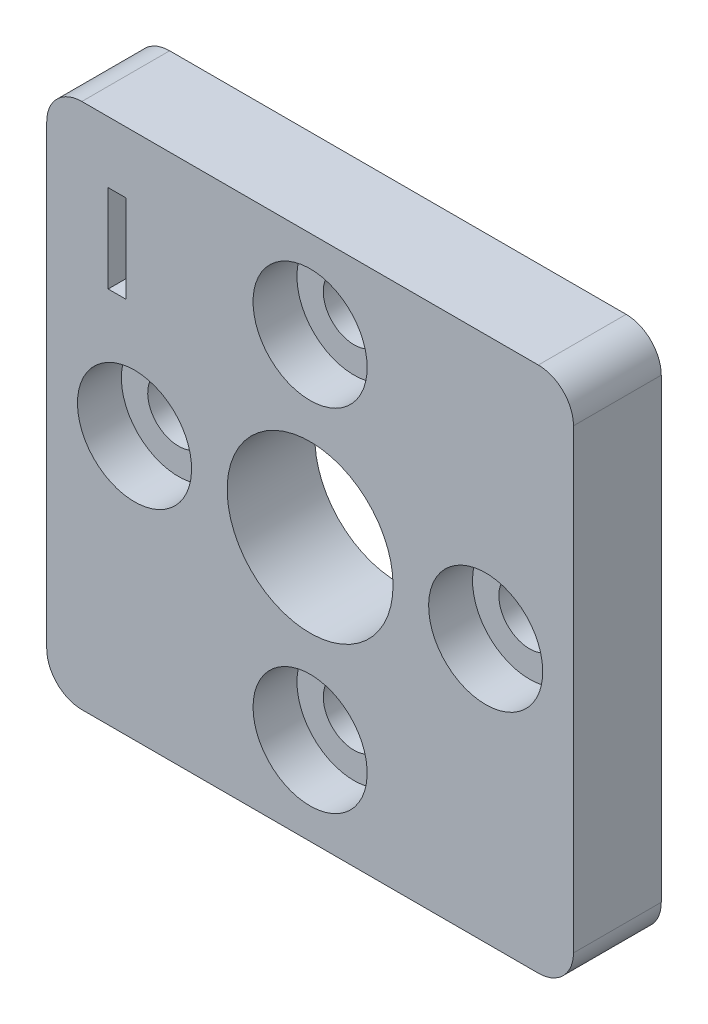
ISO-10303-21;
HEADER;
FILE_DESCRIPTION(('STEP AP214'),'2;1');
FILE_NAME('part.step','',(''),(''),'','','');
FILE_SCHEMA(('AUTOMOTIVE_DESIGN { 1 0 10303 214 1 1 1 1 }'));
ENDSEC;
DATA;
#1=APPLICATION_CONTEXT('core data for automotive mechanical design processes');
#2=APPLICATION_PROTOCOL_DEFINITION('international standard','automotive_design',2000,#1);
#3=PRODUCT_CONTEXT('',#1,'mechanical');
#4=PRODUCT('Part','Part','',(#3));
#5=PRODUCT_RELATED_PRODUCT_CATEGORY('part','',(#4));
#6=PRODUCT_DEFINITION_FORMATION('','',#4);
#7=PRODUCT_DEFINITION_CONTEXT('part definition',#1,'design');
#8=PRODUCT_DEFINITION('design','',#6,#7);
#9=PRODUCT_DEFINITION_SHAPE('','',#8);
#10=(LENGTH_UNIT() NAMED_UNIT(*) SI_UNIT(.MILLI.,.METRE.));
#11=(NAMED_UNIT(*) PLANE_ANGLE_UNIT() SI_UNIT($,.RADIAN.));
#12=(NAMED_UNIT(*) SI_UNIT($,.STERADIAN.) SOLID_ANGLE_UNIT());
#13=UNCERTAINTY_MEASURE_WITH_UNIT(LENGTH_MEASURE(1.E-05),#10,'distance_accuracy_value','');
#14=(GEOMETRIC_REPRESENTATION_CONTEXT(3) GLOBAL_UNCERTAINTY_ASSIGNED_CONTEXT((#13)) GLOBAL_UNIT_ASSIGNED_CONTEXT((#10,
#11,#12)) REPRESENTATION_CONTEXT('',''));
#15=CARTESIAN_POINT('',(0.,0.,0.));
#16=DIRECTION('',(0.,0.,1.));
#17=DIRECTION('',(1.,0.,0.));
#18=AXIS2_PLACEMENT_3D('',#15,#16,#17);
#19=CARTESIAN_POINT('',(10.,1.04286761324115E-13,5.));
#20=DIRECTION('',(0.,0.,-1.));
#21=DIRECTION('',(-1.,0.,0.));
#22=AXIS2_PLACEMENT_3D('',#19,#20,#21);
#23=CYLINDRICAL_SURFACE('',#22,1.75);
#24=CARTESIAN_POINT('',(10.,1.04286761324115E-13,0.));
#25=DIRECTION('',(0.,0.,1.));
#26=DIRECTION('',(0.,-1.,0.));
#27=AXIS2_PLACEMENT_3D('',#24,#25,#26);
#28=CIRCLE('',#27,1.75);
#29=CARTESIAN_POINT('',(10.,-1.7499999999999,0.));
#30=VERTEX_POINT('',#29);
#31=EDGE_CURVE('E199',#30,#30,#28,.T.);
#32=ORIENTED_EDGE('',*,*,#31,.F.);
#33=EDGE_LOOP('',(#32));
#34=FACE_BOUND('',#33,.T.);
#35=CARTESIAN_POINT('',(10.,1.04286761324115E-13,2.5));
#36=DIRECTION('',(0.,0.,1.));
#37=DIRECTION('',(1.,0.,0.));
#38=AXIS2_PLACEMENT_3D('',#35,#36,#37);
#39=CIRCLE('',#38,1.75);
#40=CARTESIAN_POINT('',(11.75,1.04286761324115E-13,2.5));
#41=VERTEX_POINT('',#40);
#42=EDGE_CURVE('E41',#41,#41,#39,.T.);
#43=ORIENTED_EDGE('',*,*,#42,.T.);
#44=EDGE_LOOP('',(#43));
#45=FACE_BOUND('',#44,.T.);
#46=ADVANCED_FACE('F37',(#34,#45),#23,.F.);
#47=CARTESIAN_POINT('',(0.,-10.,5.));
#48=DIRECTION('',(0.,0.,-1.));
#49=DIRECTION('',(-1.,0.,0.));
#50=AXIS2_PLACEMENT_3D('',#47,#48,#49);
#51=CYLINDRICAL_SURFACE('',#50,1.75);
#52=CARTESIAN_POINT('',(0.,-10.,0.));
#53=DIRECTION('',(0.,0.,1.));
#54=DIRECTION('',(-1.,0.,0.));
#55=AXIS2_PLACEMENT_3D('',#52,#53,#54);
#56=CIRCLE('',#55,1.75);
#57=CARTESIAN_POINT('',(-1.75,-10.,0.));
#58=VERTEX_POINT('',#57);
#59=EDGE_CURVE('E196',#58,#58,#56,.T.);
#60=ORIENTED_EDGE('',*,*,#59,.F.);
#61=EDGE_LOOP('',(#60));
#62=FACE_BOUND('',#61,.T.);
#63=CARTESIAN_POINT('',(0.,-10.,2.5));
#64=DIRECTION('',(0.,0.,1.));
#65=DIRECTION('',(1.,0.,0.));
#66=AXIS2_PLACEMENT_3D('',#63,#64,#65);
#67=CIRCLE('',#66,1.75);
#68=CARTESIAN_POINT('',(1.75,-10.,2.5));
#69=VERTEX_POINT('',#68);
#70=EDGE_CURVE('E268',#69,#69,#67,.T.);
#71=ORIENTED_EDGE('',*,*,#70,.T.);
#72=EDGE_LOOP('',(#71));
#73=FACE_BOUND('',#72,.T.);
#74=ADVANCED_FACE('F324',(#62,#73),#51,.F.);
#75=CARTESIAN_POINT('',(-10.,0.,5.));
#76=DIRECTION('',(0.,0.,-1.));
#77=DIRECTION('',(-1.,0.,0.));
#78=AXIS2_PLACEMENT_3D('',#75,#76,#77);
#79=CYLINDRICAL_SURFACE('',#78,1.75);
#80=CARTESIAN_POINT('',(-10.,0.,0.));
#81=DIRECTION('',(0.,0.,1.));
#82=DIRECTION('',(0.,1.,0.));
#83=AXIS2_PLACEMENT_3D('',#80,#81,#82);
#84=CIRCLE('',#83,1.75);
#85=CARTESIAN_POINT('',(-10.,1.74999999999996,0.));
#86=VERTEX_POINT('',#85);
#87=EDGE_CURVE('E192',#86,#86,#84,.T.);
#88=ORIENTED_EDGE('',*,*,#87,.F.);
#89=EDGE_LOOP('',(#88));
#90=FACE_BOUND('',#89,.T.);
#91=CARTESIAN_POINT('',(-10.,0.,2.5));
#92=DIRECTION('',(0.,0.,1.));
#93=DIRECTION('',(1.,0.,0.));
#94=AXIS2_PLACEMENT_3D('',#91,#92,#93);
#95=CIRCLE('',#94,1.75);
#96=CARTESIAN_POINT('',(-8.25,0.,2.5));
#97=VERTEX_POINT('',#96);
#98=EDGE_CURVE('E170',#97,#97,#95,.T.);
#99=ORIENTED_EDGE('',*,*,#98,.T.);
#100=EDGE_LOOP('',(#99));
#101=FACE_BOUND('',#100,.T.);
#102=ADVANCED_FACE('F330',(#90,#101),#79,.F.);
#103=CARTESIAN_POINT('',(0.,10.,5.));
#104=DIRECTION('',(0.,0.,-1.));
#105=DIRECTION('',(-1.,0.,0.));
#106=AXIS2_PLACEMENT_3D('',#103,#104,#105);
#107=CYLINDRICAL_SURFACE('',#106,1.75);
#108=CARTESIAN_POINT('',(0.,10.,0.));
#109=DIRECTION('',(0.,0.,1.));
#110=DIRECTION('',(1.,0.,0.));
#111=AXIS2_PLACEMENT_3D('',#108,#109,#110);
#112=CIRCLE('',#111,1.75);
#113=CARTESIAN_POINT('',(1.75,10.,0.));
#114=VERTEX_POINT('',#113);
#115=EDGE_CURVE('E195',#114,#114,#112,.T.);
#116=ORIENTED_EDGE('',*,*,#115,.F.);
#117=EDGE_LOOP('',(#116));
#118=FACE_BOUND('',#117,.T.);
#119=CARTESIAN_POINT('',(0.,10.,2.5));
#120=DIRECTION('',(0.,0.,1.));
#121=DIRECTION('',(1.,0.,0.));
#122=AXIS2_PLACEMENT_3D('',#119,#120,#121);
#123=CIRCLE('',#122,1.75);
#124=CARTESIAN_POINT('',(1.75,10.,2.5));
#125=VERTEX_POINT('',#124);
#126=EDGE_CURVE('E188',#125,#125,#123,.T.);
#127=ORIENTED_EDGE('',*,*,#126,.T.);
#128=EDGE_LOOP('',(#127));
#129=FACE_BOUND('',#128,.T.);
#130=ADVANCED_FACE('F293',(#118,#129),#107,.F.);
#131=CARTESIAN_POINT('',(0.,0.,5.));
#132=DIRECTION('',(0.,0.,1.));
#133=DIRECTION('',(1.,0.,0.));
#134=AXIS2_PLACEMENT_3D('',#131,#132,#133);
#135=PLANE('',#134);
#136=DIRECTION('',(0.,1.,0.));
#137=VECTOR('',#136,1.);
#138=CARTESIAN_POINT('',(-10.5,11.5,5.));
#139=LINE('',#138,#137);
#140=CARTESIAN_POINT('',(-10.5,6.5,5.));
#141=VERTEX_POINT('',#140);
#142=CARTESIAN_POINT('',(-10.5,11.5,5.));
#143=VERTEX_POINT('',#142);
#144=EDGE_CURVE('E54',#141,#143,#139,.T.);
#145=ORIENTED_EDGE('',*,*,#144,.F.);
#146=DIRECTION('',(1.,0.,0.));
#147=VECTOR('',#146,1.);
#148=CARTESIAN_POINT('',(-11.5,6.5,5.));
#149=LINE('',#148,#147);
#150=CARTESIAN_POINT('',(-11.5,6.5,5.));
#151=VERTEX_POINT('',#150);
#152=EDGE_CURVE('E148',#151,#141,#149,.T.);
#153=ORIENTED_EDGE('',*,*,#152,.F.);
#154=DIRECTION('',(0.,-1.,0.));
#155=VECTOR('',#154,1.);
#156=CARTESIAN_POINT('',(-11.5,11.5,5.));
#157=LINE('',#156,#155);
#158=CARTESIAN_POINT('',(-11.5,11.5,5.));
#159=VERTEX_POINT('',#158);
#160=EDGE_CURVE('E151',#159,#151,#157,.T.);
#161=ORIENTED_EDGE('',*,*,#160,.F.);
#162=DIRECTION('',(-1.,0.,0.));
#163=VECTOR('',#162,1.);
#164=CARTESIAN_POINT('',(-11.5,11.5,5.));
#165=LINE('',#164,#163);
#166=EDGE_CURVE('E157',#143,#159,#165,.T.);
#167=ORIENTED_EDGE('',*,*,#166,.F.);
#168=EDGE_LOOP('',(#145,#153,#161,#167));
#169=FACE_BOUND('',#168,.T.);
#170=CARTESIAN_POINT('',(-10.,0.,5.));
#171=DIRECTION('',(0.,0.,1.));
#172=DIRECTION('',(0.,1.,0.));
#173=AXIS2_PLACEMENT_3D('',#170,#171,#172);
#174=CIRCLE('',#173,3.25);
#175=CARTESIAN_POINT('',(-10.,3.24999999999997,5.));
#176=VERTEX_POINT('',#175);
#177=EDGE_CURVE('E171',#176,#176,#174,.T.);
#178=ORIENTED_EDGE('',*,*,#177,.F.);
#179=EDGE_LOOP('',(#178));
#180=FACE_BOUND('',#179,.T.);
#181=CARTESIAN_POINT('',(0.,-10.,5.));
#182=DIRECTION('',(0.,0.,1.));
#183=DIRECTION('',(-1.,0.,0.));
#184=AXIS2_PLACEMENT_3D('',#181,#182,#183);
#185=CIRCLE('',#184,3.25);
#186=CARTESIAN_POINT('',(-3.25,-10.,5.));
#187=VERTEX_POINT('',#186);
#188=EDGE_CURVE('E177',#187,#187,#185,.T.);
#189=ORIENTED_EDGE('',*,*,#188,.F.);
#190=EDGE_LOOP('',(#189));
#191=FACE_BOUND('',#190,.T.);
#192=CARTESIAN_POINT('',(10.,1.04286761324115E-13,5.));
#193=DIRECTION('',(0.,0.,1.));
#194=DIRECTION('',(0.,-1.,0.));
#195=AXIS2_PLACEMENT_3D('',#192,#193,#194);
#196=CIRCLE('',#195,3.25);
#197=CARTESIAN_POINT('',(10.,-3.2499999999999,5.));
#198=VERTEX_POINT('',#197);
#199=EDGE_CURVE('E163',#198,#198,#196,.T.);
#200=ORIENTED_EDGE('',*,*,#199,.F.);
#201=EDGE_LOOP('',(#200));
#202=FACE_BOUND('',#201,.T.);
#203=CARTESIAN_POINT('',(0.,10.,5.));
#204=DIRECTION('',(0.,0.,1.));
#205=DIRECTION('',(1.,0.,0.));
#206=AXIS2_PLACEMENT_3D('',#203,#204,#205);
#207=CIRCLE('',#206,3.25);
#208=CARTESIAN_POINT('',(3.25,10.,5.));
#209=VERTEX_POINT('',#208);
#210=EDGE_CURVE('E189',#209,#209,#207,.T.);
#211=ORIENTED_EDGE('',*,*,#210,.F.);
#212=EDGE_LOOP('',(#211));
#213=FACE_BOUND('',#212,.T.);
#214=DIRECTION('',(0.,-1.,0.));
#215=VECTOR('',#214,1.);
#216=CARTESIAN_POINT('',(-15.,-15.,5.));
#217=LINE('',#216,#215);
#218=CARTESIAN_POINT('',(-15.,13.,5.));
#219=VERTEX_POINT('',#218);
#220=CARTESIAN_POINT('',(-15.,-13.,5.));
#221=VERTEX_POINT('',#220);
#222=EDGE_CURVE('E211',#219,#221,#217,.T.);
#223=ORIENTED_EDGE('',*,*,#222,.T.);
#224=CARTESIAN_POINT('',(-13.,-13.,5.));
#225=DIRECTION('',(0.,0.,1.));
#226=DIRECTION('',(1.,0.,0.));
#227=AXIS2_PLACEMENT_3D('',#224,#225,#226);
#228=CIRCLE('',#227,2.);
#229=CARTESIAN_POINT('',(-13.,-15.,5.));
#230=VERTEX_POINT('',#229);
#231=EDGE_CURVE('E256',#221,#230,#228,.T.);
#232=ORIENTED_EDGE('',*,*,#231,.T.);
#233=DIRECTION('',(1.,0.,0.));
#234=VECTOR('',#233,1.);
#235=CARTESIAN_POINT('',(15.,-15.,5.));
#236=LINE('',#235,#234);
#237=CARTESIAN_POINT('',(13.,-15.,5.));
#238=VERTEX_POINT('',#237);
#239=EDGE_CURVE('E214',#230,#238,#236,.T.);
#240=ORIENTED_EDGE('',*,*,#239,.T.);
#241=CARTESIAN_POINT('',(13.,-13.,5.));
#242=DIRECTION('',(0.,0.,1.));
#243=DIRECTION('',(1.,0.,0.));
#244=AXIS2_PLACEMENT_3D('',#241,#242,#243);
#245=CIRCLE('',#244,2.);
#246=CARTESIAN_POINT('',(15.,-13.,5.));
#247=VERTEX_POINT('',#246);
#248=EDGE_CURVE('E254',#238,#247,#245,.T.);
#249=ORIENTED_EDGE('',*,*,#248,.T.);
#250=DIRECTION('',(0.,1.,0.));
#251=VECTOR('',#250,1.);
#252=CARTESIAN_POINT('',(15.,-15.,5.));
#253=LINE('',#252,#251);
#254=CARTESIAN_POINT('',(15.,13.,5.));
#255=VERTEX_POINT('',#254);
#256=EDGE_CURVE('E218',#247,#255,#253,.T.);
#257=ORIENTED_EDGE('',*,*,#256,.T.);
#258=CARTESIAN_POINT('',(13.,13.,5.));
#259=DIRECTION('',(0.,0.,1.));
#260=DIRECTION('',(1.,0.,0.));
#261=AXIS2_PLACEMENT_3D('',#258,#259,#260);
#262=CIRCLE('',#261,2.);
#263=CARTESIAN_POINT('',(13.,15.,5.));
#264=VERTEX_POINT('',#263);
#265=EDGE_CURVE('E250',#255,#264,#262,.T.);
#266=ORIENTED_EDGE('',*,*,#265,.T.);
#267=DIRECTION('',(-1.,0.,0.));
#268=VECTOR('',#267,1.);
#269=CARTESIAN_POINT('',(15.,15.,5.));
#270=LINE('',#269,#268);
#271=CARTESIAN_POINT('',(-13.,15.,5.));
#272=VERTEX_POINT('',#271);
#273=EDGE_CURVE('E221',#264,#272,#270,.T.);
#274=ORIENTED_EDGE('',*,*,#273,.T.);
#275=CARTESIAN_POINT('',(-13.,13.,5.));
#276=DIRECTION('',(0.,0.,1.));
#277=DIRECTION('',(1.,0.,0.));
#278=AXIS2_PLACEMENT_3D('',#275,#276,#277);
#279=CIRCLE('',#278,2.);
#280=EDGE_CURVE('E252',#272,#219,#279,.T.);
#281=ORIENTED_EDGE('',*,*,#280,.T.);
#282=EDGE_LOOP('',(#223,#232,#240,#249,#257,#266,#274,#281));
#283=FACE_BOUND('',#282,.T.);
#284=CARTESIAN_POINT('',(0.,0.,5.));
#285=DIRECTION('',(0.,0.,1.));
#286=DIRECTION('',(1.,0.,0.));
#287=AXIS2_PLACEMENT_3D('',#284,#285,#286);
#288=CIRCLE('',#287,4.725);
#289=CARTESIAN_POINT('',(4.725,0.,5.));
#290=VERTEX_POINT('',#289);
#291=EDGE_CURVE('E205',#290,#290,#288,.T.);
#292=ORIENTED_EDGE('',*,*,#291,.F.);
#293=EDGE_LOOP('',(#292));
#294=FACE_BOUND('',#293,.T.);
#295=ADVANCED_FACE('F289',(#169,#180,#191,#202,#213,#283,#294),#135,.T.);
#296=CARTESIAN_POINT('',(0.,0.,0.));
#297=DIRECTION('',(0.,0.,1.));
#298=DIRECTION('',(1.,0.,0.));
#299=AXIS2_PLACEMENT_3D('',#296,#297,#298);
#300=PLANE('',#299);
#301=ORIENTED_EDGE('',*,*,#87,.T.);
#302=EDGE_LOOP('',(#301));
#303=FACE_BOUND('',#302,.T.);
#304=ORIENTED_EDGE('',*,*,#59,.T.);
#305=EDGE_LOOP('',(#304));
#306=FACE_BOUND('',#305,.T.);
#307=ORIENTED_EDGE('',*,*,#31,.T.);
#308=EDGE_LOOP('',(#307));
#309=FACE_BOUND('',#308,.T.);
#310=ORIENTED_EDGE('',*,*,#115,.T.);
#311=EDGE_LOOP('',(#310));
#312=FACE_BOUND('',#311,.T.);
#313=DIRECTION('',(1.,0.,0.));
#314=VECTOR('',#313,1.);
#315=CARTESIAN_POINT('',(15.,-15.,0.));
#316=LINE('',#315,#314);
#317=CARTESIAN_POINT('',(-13.,-15.,0.));
#318=VERTEX_POINT('',#317);
#319=CARTESIAN_POINT('',(13.,-15.,0.));
#320=VERTEX_POINT('',#319);
#321=EDGE_CURVE('E226',#318,#320,#316,.T.);
#322=ORIENTED_EDGE('',*,*,#321,.F.);
#323=CARTESIAN_POINT('',(-13.,-13.,0.));
#324=DIRECTION('',(0.,0.,1.));
#325=DIRECTION('',(1.,0.,0.));
#326=AXIS2_PLACEMENT_3D('',#323,#324,#325);
#327=CIRCLE('',#326,2.);
#328=CARTESIAN_POINT('',(-15.,-13.,0.));
#329=VERTEX_POINT('',#328);
#330=EDGE_CURVE('E243',#318,#329,#327,.F.);
#331=ORIENTED_EDGE('',*,*,#330,.T.);
#332=DIRECTION('',(0.,-1.,0.));
#333=VECTOR('',#332,1.);
#334=CARTESIAN_POINT('',(-15.,-15.,0.));
#335=LINE('',#334,#333);
#336=CARTESIAN_POINT('',(-15.,13.,0.));
#337=VERTEX_POINT('',#336);
#338=EDGE_CURVE('E208',#337,#329,#335,.T.);
#339=ORIENTED_EDGE('',*,*,#338,.F.);
#340=CARTESIAN_POINT('',(-13.,13.,0.));
#341=DIRECTION('',(0.,0.,1.));
#342=DIRECTION('',(1.,0.,0.));
#343=AXIS2_PLACEMENT_3D('',#340,#341,#342);
#344=CIRCLE('',#343,2.);
#345=CARTESIAN_POINT('',(-13.,15.,0.));
#346=VERTEX_POINT('',#345);
#347=EDGE_CURVE('E239',#337,#346,#344,.F.);
#348=ORIENTED_EDGE('',*,*,#347,.T.);
#349=DIRECTION('',(-1.,0.,0.));
#350=VECTOR('',#349,1.);
#351=CARTESIAN_POINT('',(15.,15.,0.));
#352=LINE('',#351,#350);
#353=CARTESIAN_POINT('',(13.,15.,0.));
#354=VERTEX_POINT('',#353);
#355=EDGE_CURVE('E215',#354,#346,#352,.T.);
#356=ORIENTED_EDGE('',*,*,#355,.F.);
#357=CARTESIAN_POINT('',(13.,13.,0.));
#358=DIRECTION('',(0.,0.,1.));
#359=DIRECTION('',(1.,0.,0.));
#360=AXIS2_PLACEMENT_3D('',#357,#358,#359);
#361=CIRCLE('',#360,2.);
#362=CARTESIAN_POINT('',(15.,13.,0.));
#363=VERTEX_POINT('',#362);
#364=EDGE_CURVE('E237',#354,#363,#361,.F.);
#365=ORIENTED_EDGE('',*,*,#364,.T.);
#366=DIRECTION('',(0.,1.,0.));
#367=VECTOR('',#366,1.);
#368=CARTESIAN_POINT('',(15.,-15.,0.));
#369=LINE('',#368,#367);
#370=CARTESIAN_POINT('',(15.,-13.,0.));
#371=VERTEX_POINT('',#370);
#372=EDGE_CURVE('E229',#371,#363,#369,.T.);
#373=ORIENTED_EDGE('',*,*,#372,.F.);
#374=CARTESIAN_POINT('',(13.,-13.,0.));
#375=DIRECTION('',(0.,0.,1.));
#376=DIRECTION('',(1.,0.,0.));
#377=AXIS2_PLACEMENT_3D('',#374,#375,#376);
#378=CIRCLE('',#377,2.);
#379=EDGE_CURVE('E241',#371,#320,#378,.F.);
#380=ORIENTED_EDGE('',*,*,#379,.T.);
#381=EDGE_LOOP('',(#322,#331,#339,#348,#356,#365,#373,#380));
#382=FACE_BOUND('',#381,.T.);
#383=CARTESIAN_POINT('',(0.,0.,0.));
#384=DIRECTION('',(0.,0.,1.));
#385=DIRECTION('',(1.,0.,0.));
#386=AXIS2_PLACEMENT_3D('',#383,#384,#385);
#387=CIRCLE('',#386,4.725);
#388=CARTESIAN_POINT('',(4.725,0.,0.));
#389=VERTEX_POINT('',#388);
#390=EDGE_CURVE('E204',#389,#389,#387,.T.);
#391=ORIENTED_EDGE('',*,*,#390,.T.);
#392=EDGE_LOOP('',(#391));
#393=FACE_BOUND('',#392,.T.);
#394=ADVANCED_FACE('F292',(#303,#306,#309,#312,#382,#393),#300,.F.);
#395=CARTESIAN_POINT('',(-15.,-15.,5.));
#396=DIRECTION('',(1.,0.,0.));
#397=DIRECTION('',(0.,0.,-1.));
#398=AXIS2_PLACEMENT_3D('',#395,#396,#397);
#399=PLANE('',#398);
#400=ORIENTED_EDGE('',*,*,#338,.T.);
#401=DIRECTION('',(0.,0.,-1.));
#402=VECTOR('',#401,1.);
#403=CARTESIAN_POINT('',(-15.,-13.,5.));
#404=LINE('',#403,#402);
#405=EDGE_CURVE('E248',#329,#221,#404,.F.);
#406=ORIENTED_EDGE('',*,*,#405,.T.);
#407=ORIENTED_EDGE('',*,*,#222,.F.);
#408=DIRECTION('',(0.,0.,-1.));
#409=VECTOR('',#408,1.);
#410=CARTESIAN_POINT('',(-15.,13.,5.));
#411=LINE('',#410,#409);
#412=EDGE_CURVE('E245',#219,#337,#411,.T.);
#413=ORIENTED_EDGE('',*,*,#412,.T.);
#414=EDGE_LOOP('',(#400,#406,#407,#413));
#415=FACE_BOUND('',#414,.T.);
#416=ADVANCED_FACE('F312',(#415),#399,.F.);
#417=CARTESIAN_POINT('',(15.,-15.,5.));
#418=DIRECTION('',(0.,1.,0.));
#419=DIRECTION('',(-1.,0.,0.));
#420=AXIS2_PLACEMENT_3D('',#417,#418,#419);
#421=PLANE('',#420);
#422=ORIENTED_EDGE('',*,*,#239,.F.);
#423=DIRECTION('',(0.,0.,-1.));
#424=VECTOR('',#423,1.);
#425=CARTESIAN_POINT('',(-13.,-15.,5.));
#426=LINE('',#425,#424);
#427=EDGE_CURVE('E234',#230,#318,#426,.T.);
#428=ORIENTED_EDGE('',*,*,#427,.T.);
#429=ORIENTED_EDGE('',*,*,#321,.T.);
#430=DIRECTION('',(0.,0.,-1.));
#431=VECTOR('',#430,1.);
#432=CARTESIAN_POINT('',(13.,-15.,5.));
#433=LINE('',#432,#431);
#434=EDGE_CURVE('E223',#320,#238,#433,.F.);
#435=ORIENTED_EDGE('',*,*,#434,.T.);
#436=EDGE_LOOP('',(#422,#428,#429,#435));
#437=FACE_BOUND('',#436,.T.);
#438=ADVANCED_FACE('F318',(#437),#421,.F.);
#439=CARTESIAN_POINT('',(15.,-15.,5.));
#440=DIRECTION('',(-1.,0.,0.));
#441=DIRECTION('',(0.,0.,1.));
#442=AXIS2_PLACEMENT_3D('',#439,#440,#441);
#443=PLANE('',#442);
#444=ORIENTED_EDGE('',*,*,#256,.F.);
#445=DIRECTION('',(0.,0.,-1.));
#446=VECTOR('',#445,1.);
#447=CARTESIAN_POINT('',(15.,-13.,5.));
#448=LINE('',#447,#446);
#449=EDGE_CURVE('E260',#247,#371,#448,.T.);
#450=ORIENTED_EDGE('',*,*,#449,.T.);
#451=ORIENTED_EDGE('',*,*,#372,.T.);
#452=DIRECTION('',(0.,0.,-1.));
#453=VECTOR('',#452,1.);
#454=CARTESIAN_POINT('',(15.,13.,5.));
#455=LINE('',#454,#453);
#456=EDGE_CURVE('E258',#363,#255,#455,.F.);
#457=ORIENTED_EDGE('',*,*,#456,.T.);
#458=EDGE_LOOP('',(#444,#450,#451,#457));
#459=FACE_BOUND('',#458,.T.);
#460=ADVANCED_FACE('F518',(#459),#443,.F.);
#461=CARTESIAN_POINT('',(15.,15.,5.));
#462=DIRECTION('',(0.,-1.,0.));
#463=DIRECTION('',(1.,0.,0.));
#464=AXIS2_PLACEMENT_3D('',#461,#462,#463);
#465=PLANE('',#464);
#466=ORIENTED_EDGE('',*,*,#355,.T.);
#467=DIRECTION('',(0.,0.,-1.));
#468=VECTOR('',#467,1.);
#469=CARTESIAN_POINT('',(-13.,15.,5.));
#470=LINE('',#469,#468);
#471=EDGE_CURVE('E11',#346,#272,#470,.F.);
#472=ORIENTED_EDGE('',*,*,#471,.T.);
#473=ORIENTED_EDGE('',*,*,#273,.F.);
#474=DIRECTION('',(0.,0.,-1.));
#475=VECTOR('',#474,1.);
#476=CARTESIAN_POINT('',(13.,15.,5.));
#477=LINE('',#476,#475);
#478=EDGE_CURVE('E46',#264,#354,#477,.T.);
#479=ORIENTED_EDGE('',*,*,#478,.T.);
#480=EDGE_LOOP('',(#466,#472,#473,#479));
#481=FACE_BOUND('',#480,.T.);
#482=ADVANCED_FACE('F307',(#481),#465,.F.);
#483=CARTESIAN_POINT('',(0.,0.,5.));
#484=DIRECTION('',(0.,0.,-1.));
#485=DIRECTION('',(-1.,0.,0.));
#486=AXIS2_PLACEMENT_3D('',#483,#484,#485);
#487=CYLINDRICAL_SURFACE('',#486,4.725);
#488=ORIENTED_EDGE('',*,*,#291,.T.);
#489=EDGE_LOOP('',(#488));
#490=FACE_BOUND('',#489,.T.);
#491=ORIENTED_EDGE('',*,*,#390,.F.);
#492=EDGE_LOOP('',(#491));
#493=FACE_BOUND('',#492,.T.);
#494=ADVANCED_FACE('F303',(#490,#493),#487,.F.);
#495=CARTESIAN_POINT('',(-13.,-13.,5.));
#496=DIRECTION('',(0.,0.,-1.));
#497=DIRECTION('',(-1.,0.,0.));
#498=AXIS2_PLACEMENT_3D('',#495,#496,#497);
#499=CYLINDRICAL_SURFACE('',#498,2.);
#500=ORIENTED_EDGE('',*,*,#231,.F.);
#501=ORIENTED_EDGE('',*,*,#405,.F.);
#502=ORIENTED_EDGE('',*,*,#330,.F.);
#503=ORIENTED_EDGE('',*,*,#427,.F.);
#504=EDGE_LOOP('',(#500,#501,#502,#503));
#505=FACE_BOUND('',#504,.T.);
#506=ADVANCED_FACE('F306',(#505),#499,.T.);
#507=CARTESIAN_POINT('',(13.,-13.,5.));
#508=DIRECTION('',(0.,0.,-1.));
#509=DIRECTION('',(-1.,0.,0.));
#510=AXIS2_PLACEMENT_3D('',#507,#508,#509);
#511=CYLINDRICAL_SURFACE('',#510,2.);
#512=ORIENTED_EDGE('',*,*,#248,.F.);
#513=ORIENTED_EDGE('',*,*,#434,.F.);
#514=ORIENTED_EDGE('',*,*,#379,.F.);
#515=ORIENTED_EDGE('',*,*,#449,.F.);
#516=EDGE_LOOP('',(#512,#513,#514,#515));
#517=FACE_BOUND('',#516,.T.);
#518=ADVANCED_FACE('F485',(#517),#511,.T.);
#519=CARTESIAN_POINT('',(-13.,13.,5.));
#520=DIRECTION('',(0.,0.,-1.));
#521=DIRECTION('',(-1.,0.,0.));
#522=AXIS2_PLACEMENT_3D('',#519,#520,#521);
#523=CYLINDRICAL_SURFACE('',#522,2.);
#524=ORIENTED_EDGE('',*,*,#280,.F.);
#525=ORIENTED_EDGE('',*,*,#471,.F.);
#526=ORIENTED_EDGE('',*,*,#347,.F.);
#527=ORIENTED_EDGE('',*,*,#412,.F.);
#528=EDGE_LOOP('',(#524,#525,#526,#527));
#529=FACE_BOUND('',#528,.T.);
#530=ADVANCED_FACE('F360',(#529),#523,.T.);
#531=CARTESIAN_POINT('',(13.,13.,5.));
#532=DIRECTION('',(0.,0.,-1.));
#533=DIRECTION('',(-1.,0.,0.));
#534=AXIS2_PLACEMENT_3D('',#531,#532,#533);
#535=CYLINDRICAL_SURFACE('',#534,2.);
#536=ORIENTED_EDGE('',*,*,#265,.F.);
#537=ORIENTED_EDGE('',*,*,#456,.F.);
#538=ORIENTED_EDGE('',*,*,#364,.F.);
#539=ORIENTED_EDGE('',*,*,#478,.F.);
#540=EDGE_LOOP('',(#536,#537,#538,#539));
#541=FACE_BOUND('',#540,.T.);
#542=ADVANCED_FACE('F39',(#541),#535,.T.);
#543=CARTESIAN_POINT('',(0.,10.,2.5));
#544=DIRECTION('',(0.,0.,1.));
#545=DIRECTION('',(1.,0.,0.));
#546=AXIS2_PLACEMENT_3D('',#543,#544,#545);
#547=CYLINDRICAL_SURFACE('',#546,3.25);
#548=CARTESIAN_POINT('',(0.,10.,2.5));
#549=DIRECTION('',(0.,0.,1.));
#550=DIRECTION('',(1.,0.,0.));
#551=AXIS2_PLACEMENT_3D('',#548,#549,#550);
#552=CIRCLE('',#551,3.25);
#553=CARTESIAN_POINT('',(3.25,10.,2.5));
#554=VERTEX_POINT('',#553);
#555=EDGE_CURVE('E185',#554,#554,#552,.T.);
#556=ORIENTED_EDGE('',*,*,#555,.F.);
#557=EDGE_LOOP('',(#556));
#558=FACE_BOUND('',#557,.T.);
#559=ORIENTED_EDGE('',*,*,#210,.T.);
#560=EDGE_LOOP('',(#559));
#561=FACE_BOUND('',#560,.T.);
#562=ADVANCED_FACE('F350',(#558,#561),#547,.F.);
#563=CARTESIAN_POINT('',(0.,10.,2.5));
#564=DIRECTION('',(0.,0.,1.));
#565=DIRECTION('',(1.,0.,0.));
#566=AXIS2_PLACEMENT_3D('',#563,#564,#565);
#567=PLANE('',#566);
#568=ORIENTED_EDGE('',*,*,#126,.F.);
#569=EDGE_LOOP('',(#568));
#570=FACE_BOUND('',#569,.T.);
#571=ORIENTED_EDGE('',*,*,#555,.T.);
#572=EDGE_LOOP('',(#571));
#573=FACE_BOUND('',#572,.T.);
#574=ADVANCED_FACE('F346',(#570,#573),#567,.T.);
#575=CARTESIAN_POINT('',(-10.,0.,2.5));
#576=DIRECTION('',(0.,0.,1.));
#577=DIRECTION('',(1.,0.,0.));
#578=AXIS2_PLACEMENT_3D('',#575,#576,#577);
#579=CYLINDRICAL_SURFACE('',#578,3.25);
#580=CARTESIAN_POINT('',(-10.,0.,2.5));
#581=DIRECTION('',(0.,0.,1.));
#582=DIRECTION('',(0.,1.,0.));
#583=AXIS2_PLACEMENT_3D('',#580,#581,#582);
#584=CIRCLE('',#583,3.25);
#585=CARTESIAN_POINT('',(-10.,3.24999999999997,2.5));
#586=VERTEX_POINT('',#585);
#587=EDGE_CURVE('E167',#586,#586,#584,.T.);
#588=ORIENTED_EDGE('',*,*,#587,.F.);
#589=EDGE_LOOP('',(#588));
#590=FACE_BOUND('',#589,.T.);
#591=ORIENTED_EDGE('',*,*,#177,.T.);
#592=EDGE_LOOP('',(#591));
#593=FACE_BOUND('',#592,.T.);
#594=ADVANCED_FACE('F349',(#590,#593),#579,.F.);
#595=CARTESIAN_POINT('',(-10.,0.,2.5));
#596=DIRECTION('',(0.,0.,1.));
#597=DIRECTION('',(0.,1.,0.));
#598=AXIS2_PLACEMENT_3D('',#595,#596,#597);
#599=PLANE('',#598);
#600=ORIENTED_EDGE('',*,*,#98,.F.);
#601=EDGE_LOOP('',(#600));
#602=FACE_BOUND('',#601,.T.);
#603=ORIENTED_EDGE('',*,*,#587,.T.);
#604=EDGE_LOOP('',(#603));
#605=FACE_BOUND('',#604,.T.);
#606=ADVANCED_FACE('F366',(#602,#605),#599,.T.);
#607=CARTESIAN_POINT('',(0.,-10.,2.5));
#608=DIRECTION('',(0.,0.,1.));
#609=DIRECTION('',(1.,0.,0.));
#610=AXIS2_PLACEMENT_3D('',#607,#608,#609);
#611=CYLINDRICAL_SURFACE('',#610,3.25);
#612=CARTESIAN_POINT('',(0.,-10.,2.5));
#613=DIRECTION('',(0.,0.,1.));
#614=DIRECTION('',(-1.,0.,0.));
#615=AXIS2_PLACEMENT_3D('',#612,#613,#614);
#616=CIRCLE('',#615,3.25);
#617=CARTESIAN_POINT('',(-3.25,-10.,2.5));
#618=VERTEX_POINT('',#617);
#619=EDGE_CURVE('E174',#618,#618,#616,.T.);
#620=ORIENTED_EDGE('',*,*,#619,.F.);
#621=EDGE_LOOP('',(#620));
#622=FACE_BOUND('',#621,.T.);
#623=ORIENTED_EDGE('',*,*,#188,.T.);
#624=EDGE_LOOP('',(#623));
#625=FACE_BOUND('',#624,.T.);
#626=ADVANCED_FACE('F363',(#622,#625),#611,.F.);
#627=CARTESIAN_POINT('',(0.,-10.,2.5));
#628=DIRECTION('',(0.,0.,1.));
#629=DIRECTION('',(-1.,0.,0.));
#630=AXIS2_PLACEMENT_3D('',#627,#628,#629);
#631=PLANE('',#630);
#632=ORIENTED_EDGE('',*,*,#70,.F.);
#633=EDGE_LOOP('',(#632));
#634=FACE_BOUND('',#633,.T.);
#635=ORIENTED_EDGE('',*,*,#619,.T.);
#636=EDGE_LOOP('',(#635));
#637=FACE_BOUND('',#636,.T.);
#638=ADVANCED_FACE('F285',(#634,#637),#631,.T.);
#639=CARTESIAN_POINT('',(10.,1.04286761324115E-13,2.5));
#640=DIRECTION('',(0.,0.,1.));
#641=DIRECTION('',(1.,0.,0.));
#642=AXIS2_PLACEMENT_3D('',#639,#640,#641);
#643=CYLINDRICAL_SURFACE('',#642,3.25);
#644=CARTESIAN_POINT('',(10.,1.04286761324115E-13,2.5));
#645=DIRECTION('',(0.,0.,1.));
#646=DIRECTION('',(0.,-1.,0.));
#647=AXIS2_PLACEMENT_3D('',#644,#645,#646);
#648=CIRCLE('',#647,3.25);
#649=CARTESIAN_POINT('',(10.,-3.2499999999999,2.5));
#650=VERTEX_POINT('',#649);
#651=EDGE_CURVE('E180',#650,#650,#648,.T.);
#652=ORIENTED_EDGE('',*,*,#651,.F.);
#653=EDGE_LOOP('',(#652));
#654=FACE_BOUND('',#653,.T.);
#655=ORIENTED_EDGE('',*,*,#199,.T.);
#656=EDGE_LOOP('',(#655));
#657=FACE_BOUND('',#656,.T.);
#658=ADVANCED_FACE('F279',(#654,#657),#643,.F.);
#659=CARTESIAN_POINT('',(10.,1.04286761324115E-13,2.5));
#660=DIRECTION('',(0.,0.,1.));
#661=DIRECTION('',(0.,-1.,0.));
#662=AXIS2_PLACEMENT_3D('',#659,#660,#661);
#663=PLANE('',#662);
#664=ORIENTED_EDGE('',*,*,#42,.F.);
#665=EDGE_LOOP('',(#664));
#666=FACE_BOUND('',#665,.T.);
#667=ORIENTED_EDGE('',*,*,#651,.T.);
#668=EDGE_LOOP('',(#667));
#669=FACE_BOUND('',#668,.T.);
#670=ADVANCED_FACE('F276',(#666,#669),#663,.T.);
#671=CARTESIAN_POINT('',(-10.5,11.5,2.5));
#672=DIRECTION('',(1.,0.,0.));
#673=DIRECTION('',(0.,0.,-1.));
#674=AXIS2_PLACEMENT_3D('',#671,#672,#673);
#675=PLANE('',#674);
#676=ORIENTED_EDGE('',*,*,#144,.T.);
#677=DIRECTION('',(0.,0.,1.));
#678=VECTOR('',#677,1.);
#679=CARTESIAN_POINT('',(-10.5,11.5,2.5));
#680=LINE('',#679,#678);
#681=CARTESIAN_POINT('',(-10.5,11.5,2.5));
#682=VERTEX_POINT('',#681);
#683=EDGE_CURVE('E126',#682,#143,#680,.T.);
#684=ORIENTED_EDGE('',*,*,#683,.F.);
#685=DIRECTION('',(0.,1.,0.));
#686=VECTOR('',#685,1.);
#687=CARTESIAN_POINT('',(-10.5,11.5,2.5));
#688=LINE('',#687,#686);
#689=CARTESIAN_POINT('',(-10.5,6.5,2.5));
#690=VERTEX_POINT('',#689);
#691=EDGE_CURVE('E130',#690,#682,#688,.T.);
#692=ORIENTED_EDGE('',*,*,#691,.F.);
#693=DIRECTION('',(0.,0.,1.));
#694=VECTOR('',#693,1.);
#695=CARTESIAN_POINT('',(-10.5,6.5,2.5));
#696=LINE('',#695,#694);
#697=EDGE_CURVE('E161',#690,#141,#696,.T.);
#698=ORIENTED_EDGE('',*,*,#697,.T.);
#699=EDGE_LOOP('',(#676,#684,#692,#698));
#700=FACE_BOUND('',#699,.T.);
#701=ADVANCED_FACE('F128',(#700),#675,.F.);
#702=CARTESIAN_POINT('',(-11.5,6.5,2.5));
#703=DIRECTION('',(0.,-1.,0.));
#704=DIRECTION('',(0.,0.,-1.));
#705=AXIS2_PLACEMENT_3D('',#702,#703,#704);
#706=PLANE('',#705);
#707=ORIENTED_EDGE('',*,*,#152,.T.);
#708=ORIENTED_EDGE('',*,*,#697,.F.);
#709=DIRECTION('',(1.,0.,0.));
#710=VECTOR('',#709,1.);
#711=CARTESIAN_POINT('',(-11.5,6.5,2.5));
#712=LINE('',#711,#710);
#713=CARTESIAN_POINT('',(-11.5,6.5,2.5));
#714=VERTEX_POINT('',#713);
#715=EDGE_CURVE('E136',#714,#690,#712,.T.);
#716=ORIENTED_EDGE('',*,*,#715,.F.);
#717=DIRECTION('',(0.,0.,1.));
#718=VECTOR('',#717,1.);
#719=CARTESIAN_POINT('',(-11.5,6.5,2.5));
#720=LINE('',#719,#718);
#721=EDGE_CURVE('E164',#714,#151,#720,.T.);
#722=ORIENTED_EDGE('',*,*,#721,.T.);
#723=EDGE_LOOP('',(#707,#708,#716,#722));
#724=FACE_BOUND('',#723,.T.);
#725=ADVANCED_FACE('F379',(#724),#706,.F.);
#726=CARTESIAN_POINT('',(-11.5,11.5,2.5));
#727=DIRECTION('',(-1.,0.,0.));
#728=DIRECTION('',(0.,-1.,0.));
#729=AXIS2_PLACEMENT_3D('',#726,#727,#728);
#730=PLANE('',#729);
#731=ORIENTED_EDGE('',*,*,#160,.T.);
#732=ORIENTED_EDGE('',*,*,#721,.F.);
#733=DIRECTION('',(0.,-1.,0.));
#734=VECTOR('',#733,1.);
#735=CARTESIAN_POINT('',(-11.5,11.5,2.5));
#736=LINE('',#735,#734);
#737=CARTESIAN_POINT('',(-11.5,11.5,2.5));
#738=VERTEX_POINT('',#737);
#739=EDGE_CURVE('E144',#738,#714,#736,.T.);
#740=ORIENTED_EDGE('',*,*,#739,.F.);
#741=DIRECTION('',(0.,0.,1.));
#742=VECTOR('',#741,1.);
#743=CARTESIAN_POINT('',(-11.5,11.5,2.5));
#744=LINE('',#743,#742);
#745=EDGE_CURVE('E135',#738,#159,#744,.T.);
#746=ORIENTED_EDGE('',*,*,#745,.T.);
#747=EDGE_LOOP('',(#731,#732,#740,#746));
#748=FACE_BOUND('',#747,.T.);
#749=ADVANCED_FACE('F382',(#748),#730,.F.);
#750=CARTESIAN_POINT('',(-11.5,11.5,2.5));
#751=DIRECTION('',(0.,1.,0.));
#752=DIRECTION('',(0.,0.,1.));
#753=AXIS2_PLACEMENT_3D('',#750,#751,#752);
#754=PLANE('',#753);
#755=ORIENTED_EDGE('',*,*,#166,.T.);
#756=ORIENTED_EDGE('',*,*,#745,.F.);
#757=DIRECTION('',(-1.,0.,0.));
#758=VECTOR('',#757,1.);
#759=CARTESIAN_POINT('',(-11.5,11.5,2.5));
#760=LINE('',#759,#758);
#761=EDGE_CURVE('E139',#682,#738,#760,.T.);
#762=ORIENTED_EDGE('',*,*,#761,.F.);
#763=ORIENTED_EDGE('',*,*,#683,.T.);
#764=EDGE_LOOP('',(#755,#756,#762,#763));
#765=FACE_BOUND('',#764,.T.);
#766=ADVANCED_FACE('F140',(#765),#754,.F.);
#767=CARTESIAN_POINT('',(0.,0.,2.5));
#768=DIRECTION('',(0.,0.,1.));
#769=DIRECTION('',(1.,0.,0.));
#770=AXIS2_PLACEMENT_3D('',#767,#768,#769);
#771=PLANE('',#770);
#772=ORIENTED_EDGE('',*,*,#691,.T.);
#773=ORIENTED_EDGE('',*,*,#761,.T.);
#774=ORIENTED_EDGE('',*,*,#739,.T.);
#775=ORIENTED_EDGE('',*,*,#715,.T.);
#776=EDGE_LOOP('',(#772,#773,#774,#775));
#777=FACE_BOUND('',#776,.T.);
#778=ADVANCED_FACE('F146',(#777),#771,.T.);
#779=CLOSED_SHELL('',(#46,#74,#102,#130,#295,#394,#416,#438,#460,#482,#494,#506,#518,#530,#542,
#562,#574,#594,#606,#626,#638,#658,#670,#701,#725,#749,#766,#778));
#780=MANIFOLD_SOLID_BREP('B2',#779);
#781=ADVANCED_BREP_SHAPE_REPRESENTATION('',(#18,#780),#14);
#782=SHAPE_DEFINITION_REPRESENTATION(#9,#781);
ENDSEC;
END-ISO-10303-21;
